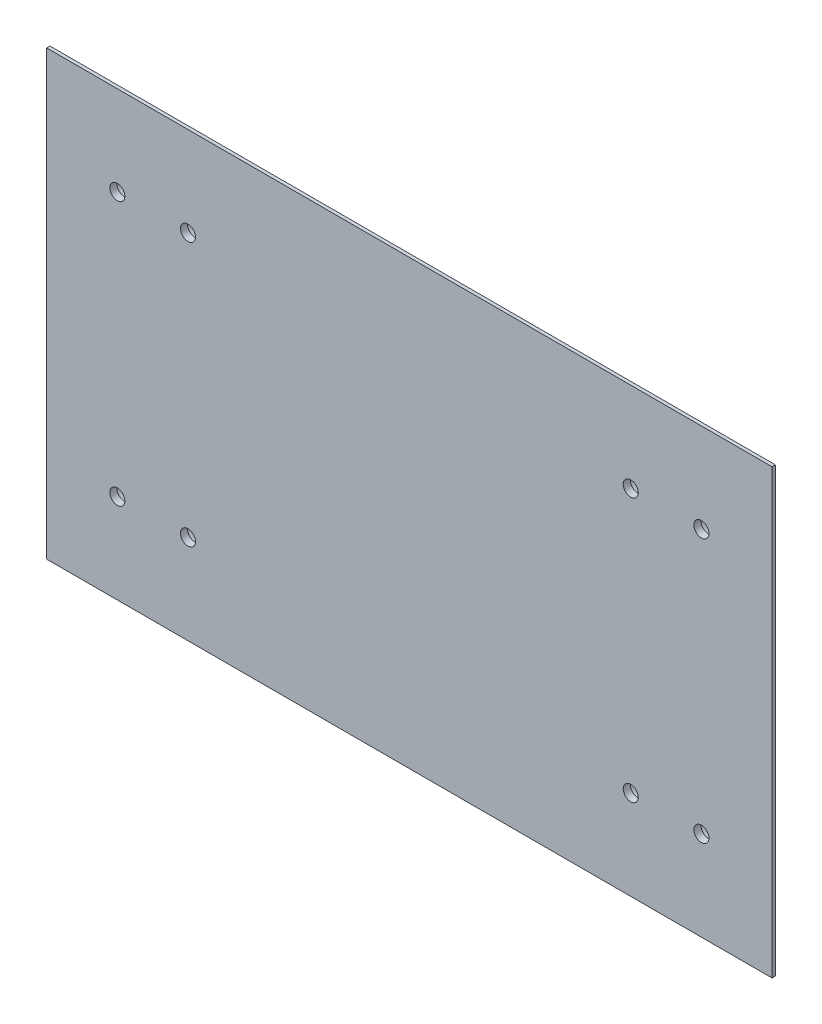
ISO-10303-21;
HEADER;
FILE_DESCRIPTION(('STEP AP214'),'2;1');
FILE_NAME('part.step','',(''),(''),'','','');
FILE_SCHEMA(('AUTOMOTIVE_DESIGN { 1 0 10303 214 1 1 1 1 }'));
ENDSEC;
DATA;
#1=APPLICATION_CONTEXT('core data for automotive mechanical design processes');
#2=APPLICATION_PROTOCOL_DEFINITION('international standard','automotive_design',2000,#1);
#3=PRODUCT_CONTEXT('',#1,'mechanical');
#4=PRODUCT('Part','Part','',(#3));
#5=PRODUCT_RELATED_PRODUCT_CATEGORY('part','',(#4));
#6=PRODUCT_DEFINITION_FORMATION('','',#4);
#7=PRODUCT_DEFINITION_CONTEXT('part definition',#1,'design');
#8=PRODUCT_DEFINITION('design','',#6,#7);
#9=PRODUCT_DEFINITION_SHAPE('','',#8);
#10=(LENGTH_UNIT() NAMED_UNIT(*) SI_UNIT(.MILLI.,.METRE.));
#11=(NAMED_UNIT(*) PLANE_ANGLE_UNIT() SI_UNIT($,.RADIAN.));
#12=(NAMED_UNIT(*) SI_UNIT($,.STERADIAN.) SOLID_ANGLE_UNIT());
#13=UNCERTAINTY_MEASURE_WITH_UNIT(LENGTH_MEASURE(1.E-05),#10,'distance_accuracy_value','');
#14=(GEOMETRIC_REPRESENTATION_CONTEXT(3) GLOBAL_UNCERTAINTY_ASSIGNED_CONTEXT((#13)) GLOBAL_UNIT_ASSIGNED_CONTEXT((#10,
#11,#12)) REPRESENTATION_CONTEXT('',''));
#15=CARTESIAN_POINT('',(0.,0.,0.));
#16=DIRECTION('',(0.,0.,1.));
#17=DIRECTION('',(1.,0.,0.));
#18=AXIS2_PLACEMENT_3D('',#15,#16,#17);
#19=CARTESIAN_POINT('',(-47.,-28.,0.));
#20=DIRECTION('',(0.,0.,1.));
#21=DIRECTION('',(1.,0.,0.));
#22=AXIS2_PLACEMENT_3D('',#19,#20,#21);
#23=CYLINDRICAL_SURFACE('',#22,1.6);
#24=CARTESIAN_POINT('',(-47.,-28.,6.));
#25=DIRECTION('',(0.,0.,-1.));
#26=DIRECTION('',(-1.,0.,0.));
#27=AXIS2_PLACEMENT_3D('',#24,#25,#26);
#28=CIRCLE('',#27,1.6);
#29=CARTESIAN_POINT('',(-48.6,-28.,6.));
#30=VERTEX_POINT('',#29);
#31=EDGE_CURVE('E146',#30,#30,#28,.T.);
#32=ORIENTED_EDGE('',*,*,#31,.F.);
#33=EDGE_LOOP('',(#32));
#34=FACE_BOUND('',#33,.T.);
#35=CARTESIAN_POINT('',(-47.,-28.,4.5));
#36=DIRECTION('',(0.,0.,-1.));
#37=DIRECTION('',(-1.,0.,0.));
#38=AXIS2_PLACEMENT_3D('',#35,#36,#37);
#39=CIRCLE('',#38,1.6);
#40=CARTESIAN_POINT('',(-48.6,-28.,4.5));
#41=VERTEX_POINT('',#40);
#42=EDGE_CURVE('E45',#41,#41,#39,.T.);
#43=ORIENTED_EDGE('',*,*,#42,.T.);
#44=EDGE_LOOP('',(#43));
#45=FACE_BOUND('',#44,.T.);
#46=ADVANCED_FACE('F41',(#34,#45),#23,.F.);
#47=CARTESIAN_POINT('',(-62.,-28.,0.));
#48=DIRECTION('',(0.,0.,1.));
#49=DIRECTION('',(1.,0.,0.));
#50=AXIS2_PLACEMENT_3D('',#47,#48,#49);
#51=CYLINDRICAL_SURFACE('',#50,1.6);
#52=CARTESIAN_POINT('',(-62.,-28.,6.));
#53=DIRECTION('',(0.,0.,-1.));
#54=DIRECTION('',(-1.,0.,0.));
#55=AXIS2_PLACEMENT_3D('',#52,#53,#54);
#56=CIRCLE('',#55,1.6);
#57=CARTESIAN_POINT('',(-63.6,-28.,6.));
#58=VERTEX_POINT('',#57);
#59=EDGE_CURVE('E215',#58,#58,#56,.T.);
#60=ORIENTED_EDGE('',*,*,#59,.F.);
#61=EDGE_LOOP('',(#60));
#62=FACE_BOUND('',#61,.T.);
#63=CARTESIAN_POINT('',(-62.,-28.,4.5));
#64=DIRECTION('',(0.,0.,-1.));
#65=DIRECTION('',(-1.,0.,0.));
#66=AXIS2_PLACEMENT_3D('',#63,#64,#65);
#67=CIRCLE('',#66,1.6);
#68=CARTESIAN_POINT('',(-63.6,-28.,4.5));
#69=VERTEX_POINT('',#68);
#70=EDGE_CURVE('E172',#69,#69,#67,.T.);
#71=ORIENTED_EDGE('',*,*,#70,.T.);
#72=EDGE_LOOP('',(#71));
#73=FACE_BOUND('',#72,.T.);
#74=ADVANCED_FACE('F321',(#62,#73),#51,.F.);
#75=CARTESIAN_POINT('',(62.,-28.,0.));
#76=DIRECTION('',(0.,0.,1.));
#77=DIRECTION('',(1.,0.,0.));
#78=AXIS2_PLACEMENT_3D('',#75,#76,#77);
#79=CYLINDRICAL_SURFACE('',#78,1.6);
#80=CARTESIAN_POINT('',(62.,-28.,6.));
#81=DIRECTION('',(0.,0.,1.));
#82=DIRECTION('',(1.,0.,0.));
#83=AXIS2_PLACEMENT_3D('',#80,#81,#82);
#84=CIRCLE('',#83,1.6);
#85=CARTESIAN_POINT('',(63.6,-28.,6.));
#86=VERTEX_POINT('',#85);
#87=EDGE_CURVE('E218',#86,#86,#84,.T.);
#88=ORIENTED_EDGE('',*,*,#87,.T.);
#89=EDGE_LOOP('',(#88));
#90=FACE_BOUND('',#89,.T.);
#91=CARTESIAN_POINT('',(62.,-28.,4.5));
#92=DIRECTION('',(0.,0.,-1.));
#93=DIRECTION('',(-1.,0.,0.));
#94=AXIS2_PLACEMENT_3D('',#91,#92,#93);
#95=CIRCLE('',#94,1.6);
#96=CARTESIAN_POINT('',(60.4,-28.,4.5));
#97=VERTEX_POINT('',#96);
#98=EDGE_CURVE('E168',#97,#97,#95,.F.);
#99=ORIENTED_EDGE('',*,*,#98,.F.);
#100=EDGE_LOOP('',(#99));
#101=FACE_BOUND('',#100,.T.);
#102=ADVANCED_FACE('F326',(#90,#101),#79,.F.);
#103=CARTESIAN_POINT('',(47.,-28.,0.));
#104=DIRECTION('',(0.,0.,1.));
#105=DIRECTION('',(1.,0.,0.));
#106=AXIS2_PLACEMENT_3D('',#103,#104,#105);
#107=CYLINDRICAL_SURFACE('',#106,1.6);
#108=CARTESIAN_POINT('',(47.,-28.,6.));
#109=DIRECTION('',(0.,0.,1.));
#110=DIRECTION('',(1.,0.,0.));
#111=AXIS2_PLACEMENT_3D('',#108,#109,#110);
#112=CIRCLE('',#111,1.6);
#113=CARTESIAN_POINT('',(48.6,-28.,6.));
#114=VERTEX_POINT('',#113);
#115=EDGE_CURVE('E221',#114,#114,#112,.T.);
#116=ORIENTED_EDGE('',*,*,#115,.T.);
#117=EDGE_LOOP('',(#116));
#118=FACE_BOUND('',#117,.T.);
#119=CARTESIAN_POINT('',(47.,-28.,4.5));
#120=DIRECTION('',(0.,0.,-1.));
#121=DIRECTION('',(-1.,0.,0.));
#122=AXIS2_PLACEMENT_3D('',#119,#120,#121);
#123=CIRCLE('',#122,1.6);
#124=CARTESIAN_POINT('',(45.4,-28.,4.5));
#125=VERTEX_POINT('',#124);
#126=EDGE_CURVE('E163',#125,#125,#123,.F.);
#127=ORIENTED_EDGE('',*,*,#126,.F.);
#128=EDGE_LOOP('',(#127));
#129=FACE_BOUND('',#128,.T.);
#130=ADVANCED_FACE('F333',(#118,#129),#107,.F.);
#131=CARTESIAN_POINT('',(62.,28.,0.));
#132=DIRECTION('',(0.,0.,1.));
#133=DIRECTION('',(1.,0.,0.));
#134=AXIS2_PLACEMENT_3D('',#131,#132,#133);
#135=CYLINDRICAL_SURFACE('',#134,1.6);
#136=CARTESIAN_POINT('',(62.,28.,6.));
#137=DIRECTION('',(0.,0.,1.));
#138=DIRECTION('',(1.,0.,0.));
#139=AXIS2_PLACEMENT_3D('',#136,#137,#138);
#140=CIRCLE('',#139,1.6);
#141=CARTESIAN_POINT('',(63.6,28.,6.));
#142=VERTEX_POINT('',#141);
#143=EDGE_CURVE('E224',#142,#142,#140,.F.);
#144=ORIENTED_EDGE('',*,*,#143,.F.);
#145=EDGE_LOOP('',(#144));
#146=FACE_BOUND('',#145,.T.);
#147=CARTESIAN_POINT('',(62.,28.,4.5));
#148=DIRECTION('',(0.,0.,-1.));
#149=DIRECTION('',(-1.,0.,0.));
#150=AXIS2_PLACEMENT_3D('',#147,#148,#149);
#151=CIRCLE('',#150,1.6);
#152=CARTESIAN_POINT('',(60.4,28.,4.5));
#153=VERTEX_POINT('',#152);
#154=EDGE_CURVE('E158',#153,#153,#151,.T.);
#155=ORIENTED_EDGE('',*,*,#154,.T.);
#156=EDGE_LOOP('',(#155));
#157=FACE_BOUND('',#156,.T.);
#158=ADVANCED_FACE('F337',(#146,#157),#135,.F.);
#159=CARTESIAN_POINT('',(47.,28.,0.));
#160=DIRECTION('',(0.,0.,1.));
#161=DIRECTION('',(1.,0.,0.));
#162=AXIS2_PLACEMENT_3D('',#159,#160,#161);
#163=CYLINDRICAL_SURFACE('',#162,1.6);
#164=CARTESIAN_POINT('',(47.,28.,6.));
#165=DIRECTION('',(0.,0.,1.));
#166=DIRECTION('',(1.,0.,0.));
#167=AXIS2_PLACEMENT_3D('',#164,#165,#166);
#168=CIRCLE('',#167,1.6);
#169=CARTESIAN_POINT('',(48.6,28.,6.));
#170=VERTEX_POINT('',#169);
#171=EDGE_CURVE('E227',#170,#170,#168,.F.);
#172=ORIENTED_EDGE('',*,*,#171,.F.);
#173=EDGE_LOOP('',(#172));
#174=FACE_BOUND('',#173,.T.);
#175=CARTESIAN_POINT('',(47.,28.,4.5));
#176=DIRECTION('',(0.,0.,-1.));
#177=DIRECTION('',(-1.,0.,0.));
#178=AXIS2_PLACEMENT_3D('',#175,#176,#177);
#179=CIRCLE('',#178,1.6);
#180=CARTESIAN_POINT('',(45.4,28.,4.5));
#181=VERTEX_POINT('',#180);
#182=EDGE_CURVE('E153',#181,#181,#179,.T.);
#183=ORIENTED_EDGE('',*,*,#182,.T.);
#184=EDGE_LOOP('',(#183));
#185=FACE_BOUND('',#184,.T.);
#186=ADVANCED_FACE('F341',(#174,#185),#163,.F.);
#187=CARTESIAN_POINT('',(-47.,28.,0.));
#188=DIRECTION('',(0.,0.,1.));
#189=DIRECTION('',(1.,0.,0.));
#190=AXIS2_PLACEMENT_3D('',#187,#188,#189);
#191=CYLINDRICAL_SURFACE('',#190,1.6);
#192=CARTESIAN_POINT('',(-47.,28.,6.));
#193=DIRECTION('',(0.,0.,1.));
#194=DIRECTION('',(1.,0.,0.));
#195=AXIS2_PLACEMENT_3D('',#192,#193,#194);
#196=CIRCLE('',#195,1.6);
#197=CARTESIAN_POINT('',(-45.4,28.,6.));
#198=VERTEX_POINT('',#197);
#199=EDGE_CURVE('E131',#198,#198,#196,.T.);
#200=ORIENTED_EDGE('',*,*,#199,.T.);
#201=EDGE_LOOP('',(#200));
#202=FACE_BOUND('',#201,.T.);
#203=CARTESIAN_POINT('',(-47.,28.,4.5));
#204=DIRECTION('',(0.,0.,-1.));
#205=DIRECTION('',(-1.,0.,0.));
#206=AXIS2_PLACEMENT_3D('',#203,#204,#205);
#207=CIRCLE('',#206,1.6);
#208=CARTESIAN_POINT('',(-48.6,28.,4.5));
#209=VERTEX_POINT('',#208);
#210=EDGE_CURVE('E148',#209,#209,#207,.F.);
#211=ORIENTED_EDGE('',*,*,#210,.F.);
#212=EDGE_LOOP('',(#211));
#213=FACE_BOUND('',#212,.T.);
#214=ADVANCED_FACE('F232',(#202,#213),#191,.F.);
#215=CARTESIAN_POINT('',(-62.,28.,0.));
#216=DIRECTION('',(0.,0.,1.));
#217=DIRECTION('',(1.,0.,0.));
#218=AXIS2_PLACEMENT_3D('',#215,#216,#217);
#219=CYLINDRICAL_SURFACE('',#218,1.6);
#220=CARTESIAN_POINT('',(-62.,28.,6.));
#221=DIRECTION('',(0.,0.,1.));
#222=DIRECTION('',(1.,0.,0.));
#223=AXIS2_PLACEMENT_3D('',#220,#221,#222);
#224=CIRCLE('',#223,1.6);
#225=CARTESIAN_POINT('',(-60.4,28.,6.));
#226=VERTEX_POINT('',#225);
#227=EDGE_CURVE('E126',#226,#226,#224,.T.);
#228=ORIENTED_EDGE('',*,*,#227,.T.);
#229=EDGE_LOOP('',(#228));
#230=FACE_BOUND('',#229,.T.);
#231=CARTESIAN_POINT('',(-62.,28.,4.5));
#232=DIRECTION('',(0.,0.,-1.));
#233=DIRECTION('',(-1.,0.,0.));
#234=AXIS2_PLACEMENT_3D('',#231,#232,#233);
#235=CIRCLE('',#234,1.6);
#236=CARTESIAN_POINT('',(-63.6,28.,4.5));
#237=VERTEX_POINT('',#236);
#238=EDGE_CURVE('E143',#237,#237,#235,.F.);
#239=ORIENTED_EDGE('',*,*,#238,.F.);
#240=EDGE_LOOP('',(#239));
#241=FACE_BOUND('',#240,.T.);
#242=ADVANCED_FACE('F239',(#230,#241),#219,.F.);
#243=CARTESIAN_POINT('',(0.,0.,6.));
#244=DIRECTION('',(0.,0.,1.));
#245=DIRECTION('',(1.,0.,0.));
#246=AXIS2_PLACEMENT_3D('',#243,#244,#245);
#247=PLANE('',#246);
#248=ORIENTED_EDGE('',*,*,#59,.T.);
#249=EDGE_LOOP('',(#248));
#250=FACE_BOUND('',#249,.T.);
#251=ORIENTED_EDGE('',*,*,#87,.F.);
#252=EDGE_LOOP('',(#251));
#253=FACE_BOUND('',#252,.T.);
#254=ORIENTED_EDGE('',*,*,#115,.F.);
#255=EDGE_LOOP('',(#254));
#256=FACE_BOUND('',#255,.T.);
#257=ORIENTED_EDGE('',*,*,#171,.T.);
#258=EDGE_LOOP('',(#257));
#259=FACE_BOUND('',#258,.T.);
#260=ORIENTED_EDGE('',*,*,#199,.F.);
#261=EDGE_LOOP('',(#260));
#262=FACE_BOUND('',#261,.T.);
#263=ORIENTED_EDGE('',*,*,#227,.F.);
#264=EDGE_LOOP('',(#263));
#265=FACE_BOUND('',#264,.T.);
#266=ORIENTED_EDGE('',*,*,#143,.T.);
#267=EDGE_LOOP('',(#266));
#268=FACE_BOUND('',#267,.T.);
#269=ORIENTED_EDGE('',*,*,#31,.T.);
#270=EDGE_LOOP('',(#269));
#271=FACE_BOUND('',#270,.T.);
#272=DIRECTION('',(0.,-1.,0.));
#273=VECTOR('',#272,1.);
#274=CARTESIAN_POINT('',(-77.,-47.,6.));
#275=LINE('',#274,#273);
#276=CARTESIAN_POINT('',(-77.,47.,6.));
#277=VERTEX_POINT('',#276);
#278=CARTESIAN_POINT('',(-77.,-47.,6.));
#279=VERTEX_POINT('',#278);
#280=EDGE_CURVE('E119',#277,#279,#275,.T.);
#281=ORIENTED_EDGE('',*,*,#280,.T.);
#282=DIRECTION('',(1.,0.,0.));
#283=VECTOR('',#282,1.);
#284=CARTESIAN_POINT('',(-77.,-47.,6.));
#285=LINE('',#284,#283);
#286=CARTESIAN_POINT('',(77.,-47.,6.));
#287=VERTEX_POINT('',#286);
#288=EDGE_CURVE('E254',#279,#287,#285,.T.);
#289=ORIENTED_EDGE('',*,*,#288,.T.);
#290=DIRECTION('',(0.,1.,0.));
#291=VECTOR('',#290,1.);
#292=CARTESIAN_POINT('',(77.,-47.,6.));
#293=LINE('',#292,#291);
#294=CARTESIAN_POINT('',(77.,47.,6.));
#295=VERTEX_POINT('',#294);
#296=EDGE_CURVE('E259',#287,#295,#293,.T.);
#297=ORIENTED_EDGE('',*,*,#296,.T.);
#298=DIRECTION('',(-1.,0.,0.));
#299=VECTOR('',#298,1.);
#300=CARTESIAN_POINT('',(-77.,47.,6.));
#301=LINE('',#300,#299);
#302=EDGE_CURVE('E256',#295,#277,#301,.T.);
#303=ORIENTED_EDGE('',*,*,#302,.T.);
#304=EDGE_LOOP('',(#281,#289,#297,#303));
#305=FACE_BOUND('',#304,.T.);
#306=ADVANCED_FACE('F235',(#250,#253,#256,#259,#262,#265,#268,#271,#305),#247,.T.);
#307=CARTESIAN_POINT('',(0.,0.,0.));
#308=DIRECTION('',(0.,0.,1.));
#309=DIRECTION('',(1.,0.,0.));
#310=AXIS2_PLACEMENT_3D('',#307,#308,#309);
#311=PLANE('',#310);
#312=CARTESIAN_POINT('',(-47.0000000000006,-28.,0.));
#313=DIRECTION('',(0.,0.,-1.));
#314=DIRECTION('',(-1.,0.,0.));
#315=AXIS2_PLACEMENT_3D('',#312,#313,#314);
#316=CIRCLE('',#315,3.5);
#317=CARTESIAN_POINT('',(-50.5000000000006,-28.,0.));
#318=VERTEX_POINT('',#317);
#319=EDGE_CURVE('E188',#318,#318,#316,.T.);
#320=ORIENTED_EDGE('',*,*,#319,.F.);
#321=EDGE_LOOP('',(#320));
#322=FACE_BOUND('',#321,.T.);
#323=CARTESIAN_POINT('',(-62.0000000000006,-28.,0.));
#324=DIRECTION('',(0.,0.,-1.));
#325=DIRECTION('',(-1.,0.,0.));
#326=AXIS2_PLACEMENT_3D('',#323,#324,#325);
#327=CIRCLE('',#326,3.49999999999999);
#328=CARTESIAN_POINT('',(-65.5000000000006,-28.,0.));
#329=VERTEX_POINT('',#328);
#330=EDGE_CURVE('E181',#329,#329,#327,.T.);
#331=ORIENTED_EDGE('',*,*,#330,.F.);
#332=EDGE_LOOP('',(#331));
#333=FACE_BOUND('',#332,.T.);
#334=CARTESIAN_POINT('',(61.9999999999994,-28.0000000000008,0.));
#335=DIRECTION('',(0.,0.,-1.));
#336=DIRECTION('',(-1.,0.,0.));
#337=AXIS2_PLACEMENT_3D('',#334,#335,#336);
#338=CIRCLE('',#337,3.5);
#339=CARTESIAN_POINT('',(58.4999999999994,-28.0000000000008,0.));
#340=VERTEX_POINT('',#339);
#341=EDGE_CURVE('E174',#340,#340,#338,.T.);
#342=ORIENTED_EDGE('',*,*,#341,.F.);
#343=EDGE_LOOP('',(#342));
#344=FACE_BOUND('',#343,.T.);
#345=CARTESIAN_POINT('',(46.9999999999994,-28.0000000000008,0.));
#346=DIRECTION('',(0.,0.,-1.));
#347=DIRECTION('',(-1.,0.,0.));
#348=AXIS2_PLACEMENT_3D('',#345,#346,#347);
#349=CIRCLE('',#348,3.5);
#350=CARTESIAN_POINT('',(43.4999999999994,-28.0000000000008,0.));
#351=VERTEX_POINT('',#350);
#352=EDGE_CURVE('E170',#351,#351,#349,.T.);
#353=ORIENTED_EDGE('',*,*,#352,.F.);
#354=EDGE_LOOP('',(#353));
#355=FACE_BOUND('',#354,.T.);
#356=CARTESIAN_POINT('',(62.,27.9999999999992,0.));
#357=DIRECTION('',(0.,0.,-1.));
#358=DIRECTION('',(-1.,0.,0.));
#359=AXIS2_PLACEMENT_3D('',#356,#357,#358);
#360=CIRCLE('',#359,3.5);
#361=CARTESIAN_POINT('',(58.5,27.9999999999992,0.));
#362=VERTEX_POINT('',#361);
#363=EDGE_CURVE('E166',#362,#362,#360,.T.);
#364=ORIENTED_EDGE('',*,*,#363,.F.);
#365=EDGE_LOOP('',(#364));
#366=FACE_BOUND('',#365,.T.);
#367=CARTESIAN_POINT('',(47.,27.9999999999992,0.));
#368=DIRECTION('',(0.,0.,-1.));
#369=DIRECTION('',(-1.,0.,0.));
#370=AXIS2_PLACEMENT_3D('',#367,#368,#369);
#371=CIRCLE('',#370,3.5);
#372=CARTESIAN_POINT('',(43.5,27.9999999999992,0.));
#373=VERTEX_POINT('',#372);
#374=EDGE_CURVE('E161',#373,#373,#371,.T.);
#375=ORIENTED_EDGE('',*,*,#374,.F.);
#376=EDGE_LOOP('',(#375));
#377=FACE_BOUND('',#376,.T.);
#378=CARTESIAN_POINT('',(-47.,28.,0.));
#379=DIRECTION('',(0.,0.,-1.));
#380=DIRECTION('',(-1.,0.,0.));
#381=AXIS2_PLACEMENT_3D('',#378,#379,#380);
#382=CIRCLE('',#381,3.5);
#383=CARTESIAN_POINT('',(-50.5,28.,0.));
#384=VERTEX_POINT('',#383);
#385=EDGE_CURVE('E156',#384,#384,#382,.T.);
#386=ORIENTED_EDGE('',*,*,#385,.F.);
#387=EDGE_LOOP('',(#386));
#388=FACE_BOUND('',#387,.T.);
#389=CARTESIAN_POINT('',(-62.,28.,0.));
#390=DIRECTION('',(0.,0.,-1.));
#391=DIRECTION('',(-1.,0.,0.));
#392=AXIS2_PLACEMENT_3D('',#389,#390,#391);
#393=CIRCLE('',#392,3.5);
#394=CARTESIAN_POINT('',(-65.5,28.,0.));
#395=VERTEX_POINT('',#394);
#396=EDGE_CURVE('E151',#395,#395,#393,.T.);
#397=ORIENTED_EDGE('',*,*,#396,.F.);
#398=EDGE_LOOP('',(#397));
#399=FACE_BOUND('',#398,.T.);
#400=DIRECTION('',(0.,-1.,0.));
#401=VECTOR('',#400,1.);
#402=CARTESIAN_POINT('',(-70.,-40.,0.));
#403=LINE('',#402,#401);
#404=CARTESIAN_POINT('',(-70.,40.,0.));
#405=VERTEX_POINT('',#404);
#406=CARTESIAN_POINT('',(-70.,-40.,0.));
#407=VERTEX_POINT('',#406);
#408=EDGE_CURVE('E122',#405,#407,#403,.T.);
#409=ORIENTED_EDGE('',*,*,#408,.F.);
#410=DIRECTION('',(-1.,0.,0.));
#411=VECTOR('',#410,1.);
#412=CARTESIAN_POINT('',(70.,40.,0.));
#413=LINE('',#412,#411);
#414=CARTESIAN_POINT('',(70.,40.,0.));
#415=VERTEX_POINT('',#414);
#416=EDGE_CURVE('E137',#415,#405,#413,.T.);
#417=ORIENTED_EDGE('',*,*,#416,.F.);
#418=DIRECTION('',(0.,1.,0.));
#419=VECTOR('',#418,1.);
#420=CARTESIAN_POINT('',(70.,-40.,0.));
#421=LINE('',#420,#419);
#422=CARTESIAN_POINT('',(70.,-40.,0.));
#423=VERTEX_POINT('',#422);
#424=EDGE_CURVE('E128',#423,#415,#421,.T.);
#425=ORIENTED_EDGE('',*,*,#424,.F.);
#426=DIRECTION('',(1.,0.,0.));
#427=VECTOR('',#426,1.);
#428=CARTESIAN_POINT('',(70.,-40.,0.));
#429=LINE('',#428,#427);
#430=EDGE_CURVE('E125',#407,#423,#429,.T.);
#431=ORIENTED_EDGE('',*,*,#430,.F.);
#432=EDGE_LOOP('',(#409,#417,#425,#431));
#433=FACE_BOUND('',#432,.T.);
#434=ADVANCED_FACE('F238',(#322,#333,#344,#355,#366,#377,#388,#399,#433),#311,.F.);
#435=CARTESIAN_POINT('',(-70.,-40.,6.));
#436=DIRECTION('',(1.,0.,0.));
#437=DIRECTION('',(0.,0.,-1.));
#438=AXIS2_PLACEMENT_3D('',#435,#436,#437);
#439=PLANE('',#438);
#440=DIRECTION('',(0.,0.,-1.));
#441=VECTOR('',#440,1.);
#442=CARTESIAN_POINT('',(-70.,-40.,6.));
#443=LINE('',#442,#441);
#444=CARTESIAN_POINT('',(-70.,-40.,5.3));
#445=VERTEX_POINT('',#444);
#446=EDGE_CURVE('E12',#445,#407,#443,.T.);
#447=ORIENTED_EDGE('',*,*,#446,.F.);
#448=DIRECTION('',(0.,-1.,0.));
#449=VECTOR('',#448,1.);
#450=CARTESIAN_POINT('',(-70.,-40.,5.3));
#451=LINE('',#450,#449);
#452=CARTESIAN_POINT('',(-70.,40.,5.3));
#453=VERTEX_POINT('',#452);
#454=EDGE_CURVE('E106',#453,#445,#451,.T.);
#455=ORIENTED_EDGE('',*,*,#454,.F.);
#456=DIRECTION('',(0.,0.,-1.));
#457=VECTOR('',#456,1.);
#458=CARTESIAN_POINT('',(-70.,40.,6.));
#459=LINE('',#458,#457);
#460=EDGE_CURVE('E66',#453,#405,#459,.T.);
#461=ORIENTED_EDGE('',*,*,#460,.T.);
#462=ORIENTED_EDGE('',*,*,#408,.T.);
#463=EDGE_LOOP('',(#447,#455,#461,#462));
#464=FACE_BOUND('',#463,.T.);
#465=ADVANCED_FACE('F43',(#464),#439,.F.);
#466=CARTESIAN_POINT('',(70.,-40.,6.));
#467=DIRECTION('',(0.,1.,0.));
#468=DIRECTION('',(-1.,0.,0.));
#469=AXIS2_PLACEMENT_3D('',#466,#467,#468);
#470=PLANE('',#469);
#471=DIRECTION('',(0.,0.,-1.));
#472=VECTOR('',#471,1.);
#473=CARTESIAN_POINT('',(70.,-40.,6.));
#474=LINE('',#473,#472);
#475=CARTESIAN_POINT('',(70.,-40.,5.3));
#476=VERTEX_POINT('',#475);
#477=EDGE_CURVE('E50',#476,#423,#474,.T.);
#478=ORIENTED_EDGE('',*,*,#477,.F.);
#479=DIRECTION('',(1.,0.,0.));
#480=VECTOR('',#479,1.);
#481=CARTESIAN_POINT('',(-70.,-40.,5.3));
#482=LINE('',#481,#480);
#483=EDGE_CURVE('E110',#445,#476,#482,.T.);
#484=ORIENTED_EDGE('',*,*,#483,.F.);
#485=ORIENTED_EDGE('',*,*,#446,.T.);
#486=ORIENTED_EDGE('',*,*,#430,.T.);
#487=EDGE_LOOP('',(#478,#484,#485,#486));
#488=FACE_BOUND('',#487,.T.);
#489=ADVANCED_FACE('F116',(#488),#470,.F.);
#490=CARTESIAN_POINT('',(70.,-40.,6.));
#491=DIRECTION('',(-1.,0.,0.));
#492=DIRECTION('',(0.,0.,1.));
#493=AXIS2_PLACEMENT_3D('',#490,#491,#492);
#494=PLANE('',#493);
#495=DIRECTION('',(0.,0.,-1.));
#496=VECTOR('',#495,1.);
#497=CARTESIAN_POINT('',(70.,40.,6.));
#498=LINE('',#497,#496);
#499=CARTESIAN_POINT('',(70.,40.,5.3));
#500=VERTEX_POINT('',#499);
#501=EDGE_CURVE('E140',#500,#415,#498,.T.);
#502=ORIENTED_EDGE('',*,*,#501,.F.);
#503=DIRECTION('',(0.,1.,0.));
#504=VECTOR('',#503,1.);
#505=CARTESIAN_POINT('',(70.,-40.,5.3));
#506=LINE('',#505,#504);
#507=EDGE_CURVE('E58',#476,#500,#506,.T.);
#508=ORIENTED_EDGE('',*,*,#507,.F.);
#509=ORIENTED_EDGE('',*,*,#477,.T.);
#510=ORIENTED_EDGE('',*,*,#424,.T.);
#511=EDGE_LOOP('',(#502,#508,#509,#510));
#512=FACE_BOUND('',#511,.T.);
#513=ADVANCED_FACE('F353',(#512),#494,.F.);
#514=CARTESIAN_POINT('',(70.,40.,6.));
#515=DIRECTION('',(0.,-1.,0.));
#516=DIRECTION('',(1.,0.,0.));
#517=AXIS2_PLACEMENT_3D('',#514,#515,#516);
#518=PLANE('',#517);
#519=ORIENTED_EDGE('',*,*,#460,.F.);
#520=DIRECTION('',(-1.,0.,0.));
#521=VECTOR('',#520,1.);
#522=CARTESIAN_POINT('',(-70.,40.,5.3));
#523=LINE('',#522,#521);
#524=EDGE_CURVE('E111',#500,#453,#523,.T.);
#525=ORIENTED_EDGE('',*,*,#524,.F.);
#526=ORIENTED_EDGE('',*,*,#501,.T.);
#527=ORIENTED_EDGE('',*,*,#416,.T.);
#528=EDGE_LOOP('',(#519,#525,#526,#527));
#529=FACE_BOUND('',#528,.T.);
#530=ADVANCED_FACE('F315',(#529),#518,.F.);
#531=CARTESIAN_POINT('',(-62.,28.,4.5));
#532=DIRECTION('',(0.,0.,-1.));
#533=DIRECTION('',(-1.,0.,0.));
#534=AXIS2_PLACEMENT_3D('',#531,#532,#533);
#535=PLANE('',#534);
#536=CARTESIAN_POINT('',(-62.,28.,4.5));
#537=DIRECTION('',(0.,0.,-1.));
#538=DIRECTION('',(-1.,0.,0.));
#539=AXIS2_PLACEMENT_3D('',#536,#537,#538);
#540=CIRCLE('',#539,3.5);
#541=CARTESIAN_POINT('',(-65.5,28.,4.5));
#542=VERTEX_POINT('',#541);
#543=EDGE_CURVE('E147',#542,#542,#540,.T.);
#544=ORIENTED_EDGE('',*,*,#543,.T.);
#545=EDGE_LOOP('',(#544));
#546=FACE_BOUND('',#545,.T.);
#547=ORIENTED_EDGE('',*,*,#238,.T.);
#548=EDGE_LOOP('',(#547));
#549=FACE_BOUND('',#548,.T.);
#550=ADVANCED_FACE('F305',(#546,#549),#535,.T.);
#551=CARTESIAN_POINT('',(-62.,28.,4.5));
#552=DIRECTION('',(0.,0.,-1.));
#553=DIRECTION('',(-1.,0.,0.));
#554=AXIS2_PLACEMENT_3D('',#551,#552,#553);
#555=CYLINDRICAL_SURFACE('',#554,3.5);
#556=ORIENTED_EDGE('',*,*,#543,.F.);
#557=EDGE_LOOP('',(#556));
#558=FACE_BOUND('',#557,.T.);
#559=ORIENTED_EDGE('',*,*,#396,.T.);
#560=EDGE_LOOP('',(#559));
#561=FACE_BOUND('',#560,.T.);
#562=ADVANCED_FACE('F302',(#558,#561),#555,.F.);
#563=CARTESIAN_POINT('',(-47.,28.,4.5));
#564=DIRECTION('',(0.,0.,-1.));
#565=DIRECTION('',(-1.,0.,0.));
#566=AXIS2_PLACEMENT_3D('',#563,#564,#565);
#567=PLANE('',#566);
#568=CARTESIAN_POINT('',(-47.,28.,4.5));
#569=DIRECTION('',(0.,0.,-1.));
#570=DIRECTION('',(-1.,0.,0.));
#571=AXIS2_PLACEMENT_3D('',#568,#569,#570);
#572=CIRCLE('',#571,3.5);
#573=CARTESIAN_POINT('',(-50.5,28.,4.5));
#574=VERTEX_POINT('',#573);
#575=EDGE_CURVE('E152',#574,#574,#572,.T.);
#576=ORIENTED_EDGE('',*,*,#575,.T.);
#577=EDGE_LOOP('',(#576));
#578=FACE_BOUND('',#577,.T.);
#579=ORIENTED_EDGE('',*,*,#210,.T.);
#580=EDGE_LOOP('',(#579));
#581=FACE_BOUND('',#580,.T.);
#582=ADVANCED_FACE('F304',(#578,#581),#567,.T.);
#583=CARTESIAN_POINT('',(-47.,28.,4.5));
#584=DIRECTION('',(0.,0.,-1.));
#585=DIRECTION('',(-1.,0.,0.));
#586=AXIS2_PLACEMENT_3D('',#583,#584,#585);
#587=CYLINDRICAL_SURFACE('',#586,3.5);
#588=ORIENTED_EDGE('',*,*,#575,.F.);
#589=EDGE_LOOP('',(#588));
#590=FACE_BOUND('',#589,.T.);
#591=ORIENTED_EDGE('',*,*,#385,.T.);
#592=EDGE_LOOP('',(#591));
#593=FACE_BOUND('',#592,.T.);
#594=ADVANCED_FACE('F312',(#590,#593),#587,.F.);
#595=CARTESIAN_POINT('',(47.,27.9999999999992,4.5));
#596=DIRECTION('',(0.,0.,-1.));
#597=DIRECTION('',(-1.,0.,0.));
#598=AXIS2_PLACEMENT_3D('',#595,#596,#597);
#599=CYLINDRICAL_SURFACE('',#598,3.5);
#600=CARTESIAN_POINT('',(47.,27.9999999999992,4.5));
#601=DIRECTION('',(0.,0.,-1.));
#602=DIRECTION('',(-1.,0.,0.));
#603=AXIS2_PLACEMENT_3D('',#600,#601,#602);
#604=CIRCLE('',#603,3.5);
#605=CARTESIAN_POINT('',(43.5,27.9999999999992,4.5));
#606=VERTEX_POINT('',#605);
#607=EDGE_CURVE('E157',#606,#606,#604,.T.);
#608=ORIENTED_EDGE('',*,*,#607,.F.);
#609=EDGE_LOOP('',(#608));
#610=FACE_BOUND('',#609,.T.);
#611=ORIENTED_EDGE('',*,*,#374,.T.);
#612=EDGE_LOOP('',(#611));
#613=FACE_BOUND('',#612,.T.);
#614=ADVANCED_FACE('F481',(#610,#613),#599,.F.);
#615=CARTESIAN_POINT('',(47.,27.9999999999992,4.5));
#616=DIRECTION('',(0.,0.,-1.));
#617=DIRECTION('',(-1.,0.,0.));
#618=AXIS2_PLACEMENT_3D('',#615,#616,#617);
#619=PLANE('',#618);
#620=ORIENTED_EDGE('',*,*,#182,.F.);
#621=EDGE_LOOP('',(#620));
#622=FACE_BOUND('',#621,.T.);
#623=ORIENTED_EDGE('',*,*,#607,.T.);
#624=EDGE_LOOP('',(#623));
#625=FACE_BOUND('',#624,.T.);
#626=ADVANCED_FACE('F471',(#622,#625),#619,.T.);
#627=CARTESIAN_POINT('',(62.,27.9999999999992,4.5));
#628=DIRECTION('',(0.,0.,-1.));
#629=DIRECTION('',(-1.,0.,0.));
#630=AXIS2_PLACEMENT_3D('',#627,#628,#629);
#631=CYLINDRICAL_SURFACE('',#630,3.5);
#632=CARTESIAN_POINT('',(62.,27.9999999999992,4.5));
#633=DIRECTION('',(0.,0.,-1.));
#634=DIRECTION('',(-1.,0.,0.));
#635=AXIS2_PLACEMENT_3D('',#632,#633,#634);
#636=CIRCLE('',#635,3.5);
#637=CARTESIAN_POINT('',(58.5,27.9999999999992,4.5));
#638=VERTEX_POINT('',#637);
#639=EDGE_CURVE('E162',#638,#638,#636,.T.);
#640=ORIENTED_EDGE('',*,*,#639,.F.);
#641=EDGE_LOOP('',(#640));
#642=FACE_BOUND('',#641,.T.);
#643=ORIENTED_EDGE('',*,*,#363,.T.);
#644=EDGE_LOOP('',(#643));
#645=FACE_BOUND('',#644,.T.);
#646=ADVANCED_FACE('F461',(#642,#645),#631,.F.);
#647=CARTESIAN_POINT('',(62.,27.9999999999992,4.5));
#648=DIRECTION('',(0.,0.,-1.));
#649=DIRECTION('',(-1.,0.,0.));
#650=AXIS2_PLACEMENT_3D('',#647,#648,#649);
#651=PLANE('',#650);
#652=ORIENTED_EDGE('',*,*,#154,.F.);
#653=EDGE_LOOP('',(#652));
#654=FACE_BOUND('',#653,.T.);
#655=ORIENTED_EDGE('',*,*,#639,.T.);
#656=EDGE_LOOP('',(#655));
#657=FACE_BOUND('',#656,.T.);
#658=ADVANCED_FACE('F451',(#654,#657),#651,.T.);
#659=CARTESIAN_POINT('',(46.9999999999994,-28.0000000000008,4.5));
#660=DIRECTION('',(0.,0.,-1.));
#661=DIRECTION('',(-1.,0.,0.));
#662=AXIS2_PLACEMENT_3D('',#659,#660,#661);
#663=PLANE('',#662);
#664=CARTESIAN_POINT('',(46.9999999999994,-28.0000000000008,4.5));
#665=DIRECTION('',(0.,0.,-1.));
#666=DIRECTION('',(-1.,0.,0.));
#667=AXIS2_PLACEMENT_3D('',#664,#665,#666);
#668=CIRCLE('',#667,3.5);
#669=CARTESIAN_POINT('',(43.4999999999994,-28.0000000000008,4.5));
#670=VERTEX_POINT('',#669);
#671=EDGE_CURVE('E167',#670,#670,#668,.T.);
#672=ORIENTED_EDGE('',*,*,#671,.T.);
#673=EDGE_LOOP('',(#672));
#674=FACE_BOUND('',#673,.T.);
#675=ORIENTED_EDGE('',*,*,#126,.T.);
#676=EDGE_LOOP('',(#675));
#677=FACE_BOUND('',#676,.T.);
#678=ADVANCED_FACE('F441',(#674,#677),#663,.T.);
#679=CARTESIAN_POINT('',(46.9999999999994,-28.0000000000008,4.5));
#680=DIRECTION('',(0.,0.,-1.));
#681=DIRECTION('',(-1.,0.,0.));
#682=AXIS2_PLACEMENT_3D('',#679,#680,#681);
#683=CYLINDRICAL_SURFACE('',#682,3.5);
#684=ORIENTED_EDGE('',*,*,#671,.F.);
#685=EDGE_LOOP('',(#684));
#686=FACE_BOUND('',#685,.T.);
#687=ORIENTED_EDGE('',*,*,#352,.T.);
#688=EDGE_LOOP('',(#687));
#689=FACE_BOUND('',#688,.T.);
#690=ADVANCED_FACE('F431',(#686,#689),#683,.F.);
#691=CARTESIAN_POINT('',(61.9999999999994,-28.0000000000008,4.5));
#692=DIRECTION('',(0.,0.,-1.));
#693=DIRECTION('',(-1.,0.,0.));
#694=AXIS2_PLACEMENT_3D('',#691,#692,#693);
#695=PLANE('',#694);
#696=CARTESIAN_POINT('',(61.9999999999994,-28.0000000000008,4.5));
#697=DIRECTION('',(0.,0.,-1.));
#698=DIRECTION('',(-1.,0.,0.));
#699=AXIS2_PLACEMENT_3D('',#696,#697,#698);
#700=CIRCLE('',#699,3.5);
#701=CARTESIAN_POINT('',(58.4999999999994,-28.0000000000008,4.5));
#702=VERTEX_POINT('',#701);
#703=EDGE_CURVE('E171',#702,#702,#700,.T.);
#704=ORIENTED_EDGE('',*,*,#703,.T.);
#705=EDGE_LOOP('',(#704));
#706=FACE_BOUND('',#705,.T.);
#707=ORIENTED_EDGE('',*,*,#98,.T.);
#708=EDGE_LOOP('',(#707));
#709=FACE_BOUND('',#708,.T.);
#710=ADVANCED_FACE('F421',(#706,#709),#695,.T.);
#711=CARTESIAN_POINT('',(61.9999999999994,-28.0000000000008,4.5));
#712=DIRECTION('',(0.,0.,-1.));
#713=DIRECTION('',(-1.,0.,0.));
#714=AXIS2_PLACEMENT_3D('',#711,#712,#713);
#715=CYLINDRICAL_SURFACE('',#714,3.5);
#716=ORIENTED_EDGE('',*,*,#703,.F.);
#717=EDGE_LOOP('',(#716));
#718=FACE_BOUND('',#717,.T.);
#719=ORIENTED_EDGE('',*,*,#341,.T.);
#720=EDGE_LOOP('',(#719));
#721=FACE_BOUND('',#720,.T.);
#722=ADVANCED_FACE('F411',(#718,#721),#715,.F.);
#723=CARTESIAN_POINT('',(-62.0000000000006,-28.,4.5));
#724=DIRECTION('',(0.,0.,-1.));
#725=DIRECTION('',(-1.,0.,0.));
#726=AXIS2_PLACEMENT_3D('',#723,#724,#725);
#727=CYLINDRICAL_SURFACE('',#726,3.49999999999999);
#728=CARTESIAN_POINT('',(-62.0000000000006,-28.,4.5));
#729=DIRECTION('',(0.,0.,-1.));
#730=DIRECTION('',(-1.,0.,0.));
#731=AXIS2_PLACEMENT_3D('',#728,#729,#730);
#732=CIRCLE('',#731,3.49999999999999);
#733=CARTESIAN_POINT('',(-65.5000000000006,-28.,4.5));
#734=VERTEX_POINT('',#733);
#735=EDGE_CURVE('E175',#734,#734,#732,.T.);
#736=ORIENTED_EDGE('',*,*,#735,.F.);
#737=EDGE_LOOP('',(#736));
#738=FACE_BOUND('',#737,.T.);
#739=ORIENTED_EDGE('',*,*,#330,.T.);
#740=EDGE_LOOP('',(#739));
#741=FACE_BOUND('',#740,.T.);
#742=ADVANCED_FACE('F401',(#738,#741),#727,.F.);
#743=CARTESIAN_POINT('',(-62.0000000000006,-28.,4.5));
#744=DIRECTION('',(0.,0.,-1.));
#745=DIRECTION('',(-1.,0.,0.));
#746=AXIS2_PLACEMENT_3D('',#743,#744,#745);
#747=PLANE('',#746);
#748=ORIENTED_EDGE('',*,*,#70,.F.);
#749=EDGE_LOOP('',(#748));
#750=FACE_BOUND('',#749,.T.);
#751=ORIENTED_EDGE('',*,*,#735,.T.);
#752=EDGE_LOOP('',(#751));
#753=FACE_BOUND('',#752,.T.);
#754=ADVANCED_FACE('F391',(#750,#753),#747,.T.);
#755=CARTESIAN_POINT('',(-47.0000000000006,-28.,4.5));
#756=DIRECTION('',(0.,0.,-1.));
#757=DIRECTION('',(-1.,0.,0.));
#758=AXIS2_PLACEMENT_3D('',#755,#756,#757);
#759=CYLINDRICAL_SURFACE('',#758,3.5);
#760=CARTESIAN_POINT('',(-47.0000000000006,-28.,4.5));
#761=DIRECTION('',(0.,0.,-1.));
#762=DIRECTION('',(-1.,0.,0.));
#763=AXIS2_PLACEMENT_3D('',#760,#761,#762);
#764=CIRCLE('',#763,3.5);
#765=CARTESIAN_POINT('',(-50.5000000000006,-28.,4.5));
#766=VERTEX_POINT('',#765);
#767=EDGE_CURVE('E275',#766,#766,#764,.T.);
#768=ORIENTED_EDGE('',*,*,#767,.F.);
#769=EDGE_LOOP('',(#768));
#770=FACE_BOUND('',#769,.T.);
#771=ORIENTED_EDGE('',*,*,#319,.T.);
#772=EDGE_LOOP('',(#771));
#773=FACE_BOUND('',#772,.T.);
#774=ADVANCED_FACE('F283',(#770,#773),#759,.F.);
#775=CARTESIAN_POINT('',(-47.0000000000006,-28.,4.5));
#776=DIRECTION('',(0.,0.,-1.));
#777=DIRECTION('',(-1.,0.,0.));
#778=AXIS2_PLACEMENT_3D('',#775,#776,#777);
#779=PLANE('',#778);
#780=ORIENTED_EDGE('',*,*,#42,.F.);
#781=EDGE_LOOP('',(#780));
#782=FACE_BOUND('',#781,.T.);
#783=ORIENTED_EDGE('',*,*,#767,.T.);
#784=EDGE_LOOP('',(#783));
#785=FACE_BOUND('',#784,.T.);
#786=ADVANCED_FACE('F378',(#782,#785),#779,.T.);
#787=CARTESIAN_POINT('',(-77.,-47.,5.3));
#788=DIRECTION('',(-1.,0.,0.));
#789=DIRECTION('',(0.,0.,1.));
#790=AXIS2_PLACEMENT_3D('',#787,#788,#789);
#791=PLANE('',#790);
#792=ORIENTED_EDGE('',*,*,#280,.F.);
#793=DIRECTION('',(0.,0.,1.));
#794=VECTOR('',#793,1.);
#795=CARTESIAN_POINT('',(-77.,47.,5.3));
#796=LINE('',#795,#794);
#797=CARTESIAN_POINT('',(-77.,47.,5.3));
#798=VERTEX_POINT('',#797);
#799=EDGE_CURVE('E268',#798,#277,#796,.T.);
#800=ORIENTED_EDGE('',*,*,#799,.F.);
#801=DIRECTION('',(0.,-1.,0.));
#802=VECTOR('',#801,1.);
#803=CARTESIAN_POINT('',(-77.,-47.,5.3));
#804=LINE('',#803,#802);
#805=CARTESIAN_POINT('',(-77.,-47.,5.3));
#806=VERTEX_POINT('',#805);
#807=EDGE_CURVE('E267',#798,#806,#804,.T.);
#808=ORIENTED_EDGE('',*,*,#807,.T.);
#809=DIRECTION('',(0.,0.,1.));
#810=VECTOR('',#809,1.);
#811=CARTESIAN_POINT('',(-77.,-47.,5.3));
#812=LINE('',#811,#810);
#813=EDGE_CURVE('E274',#806,#279,#812,.T.);
#814=ORIENTED_EDGE('',*,*,#813,.T.);
#815=EDGE_LOOP('',(#792,#800,#808,#814));
#816=FACE_BOUND('',#815,.T.);
#817=ADVANCED_FACE('F381',(#816),#791,.T.);
#818=CARTESIAN_POINT('',(-77.,47.,5.3));
#819=DIRECTION('',(0.,1.,0.));
#820=DIRECTION('',(-1.,0.,0.));
#821=AXIS2_PLACEMENT_3D('',#818,#819,#820);
#822=PLANE('',#821);
#823=ORIENTED_EDGE('',*,*,#302,.F.);
#824=DIRECTION('',(0.,0.,1.));
#825=VECTOR('',#824,1.);
#826=CARTESIAN_POINT('',(77.,47.,5.3));
#827=LINE('',#826,#825);
#828=CARTESIAN_POINT('',(77.,47.,5.3));
#829=VERTEX_POINT('',#828);
#830=EDGE_CURVE('E270',#829,#295,#827,.T.);
#831=ORIENTED_EDGE('',*,*,#830,.F.);
#832=DIRECTION('',(-1.,0.,0.));
#833=VECTOR('',#832,1.);
#834=CARTESIAN_POINT('',(-77.,47.,5.3));
#835=LINE('',#834,#833);
#836=EDGE_CURVE('E262',#829,#798,#835,.T.);
#837=ORIENTED_EDGE('',*,*,#836,.T.);
#838=ORIENTED_EDGE('',*,*,#799,.T.);
#839=EDGE_LOOP('',(#823,#831,#837,#838));
#840=FACE_BOUND('',#839,.T.);
#841=ADVANCED_FACE('F593',(#840),#822,.T.);
#842=CARTESIAN_POINT('',(77.,-47.,5.3));
#843=DIRECTION('',(1.,0.,0.));
#844=DIRECTION('',(0.,0.,-1.));
#845=AXIS2_PLACEMENT_3D('',#842,#843,#844);
#846=PLANE('',#845);
#847=ORIENTED_EDGE('',*,*,#296,.F.);
#848=DIRECTION('',(0.,0.,1.));
#849=VECTOR('',#848,1.);
#850=CARTESIAN_POINT('',(77.,-47.,5.3));
#851=LINE('',#850,#849);
#852=CARTESIAN_POINT('',(77.,-47.,5.3));
#853=VERTEX_POINT('',#852);
#854=EDGE_CURVE('E272',#853,#287,#851,.T.);
#855=ORIENTED_EDGE('',*,*,#854,.F.);
#856=DIRECTION('',(0.,1.,0.));
#857=VECTOR('',#856,1.);
#858=CARTESIAN_POINT('',(77.,-47.,5.3));
#859=LINE('',#858,#857);
#860=EDGE_CURVE('E645',#853,#829,#859,.T.);
#861=ORIENTED_EDGE('',*,*,#860,.T.);
#862=ORIENTED_EDGE('',*,*,#830,.T.);
#863=EDGE_LOOP('',(#847,#855,#861,#862));
#864=FACE_BOUND('',#863,.T.);
#865=ADVANCED_FACE('F602',(#864),#846,.T.);
#866=CARTESIAN_POINT('',(-77.,-47.,5.3));
#867=DIRECTION('',(0.,-1.,0.));
#868=DIRECTION('',(0.,0.,-1.));
#869=AXIS2_PLACEMENT_3D('',#866,#867,#868);
#870=PLANE('',#869);
#871=ORIENTED_EDGE('',*,*,#288,.F.);
#872=ORIENTED_EDGE('',*,*,#813,.F.);
#873=DIRECTION('',(1.,0.,0.));
#874=VECTOR('',#873,1.);
#875=CARTESIAN_POINT('',(-77.,-47.,5.3));
#876=LINE('',#875,#874);
#877=EDGE_CURVE('E637',#806,#853,#876,.T.);
#878=ORIENTED_EDGE('',*,*,#877,.T.);
#879=ORIENTED_EDGE('',*,*,#854,.T.);
#880=EDGE_LOOP('',(#871,#872,#878,#879));
#881=FACE_BOUND('',#880,.T.);
#882=ADVANCED_FACE('F612',(#881),#870,.T.);
#883=CARTESIAN_POINT('',(0.,0.,5.3));
#884=DIRECTION('',(0.,0.,-1.));
#885=DIRECTION('',(-1.,0.,0.));
#886=AXIS2_PLACEMENT_3D('',#883,#884,#885);
#887=PLANE('',#886);
#888=ORIENTED_EDGE('',*,*,#507,.T.);
#889=ORIENTED_EDGE('',*,*,#524,.T.);
#890=ORIENTED_EDGE('',*,*,#454,.T.);
#891=ORIENTED_EDGE('',*,*,#483,.T.);
#892=EDGE_LOOP('',(#888,#889,#890,#891));
#893=FACE_BOUND('',#892,.T.);
#894=ORIENTED_EDGE('',*,*,#807,.F.);
#895=ORIENTED_EDGE('',*,*,#836,.F.);
#896=ORIENTED_EDGE('',*,*,#860,.F.);
#897=ORIENTED_EDGE('',*,*,#877,.F.);
#898=EDGE_LOOP('',(#894,#895,#896,#897));
#899=FACE_BOUND('',#898,.T.);
#900=ADVANCED_FACE('F108',(#893,#899),#887,.T.);
#901=CLOSED_SHELL('',(#46,#74,#102,#130,#158,#186,#214,#242,#306,#434,#465,#489,#513,#530,#550,
#562,#582,#594,#614,#626,#646,#658,#678,#690,#710,#722,#742,#754,#774,#786,#817,#841,#865,#882,#900));
#902=MANIFOLD_SOLID_BREP('B2',#901);
#903=ADVANCED_BREP_SHAPE_REPRESENTATION('',(#18,#902),#14);
#904=SHAPE_DEFINITION_REPRESENTATION(#9,#903);
ENDSEC;
END-ISO-10303-21;
